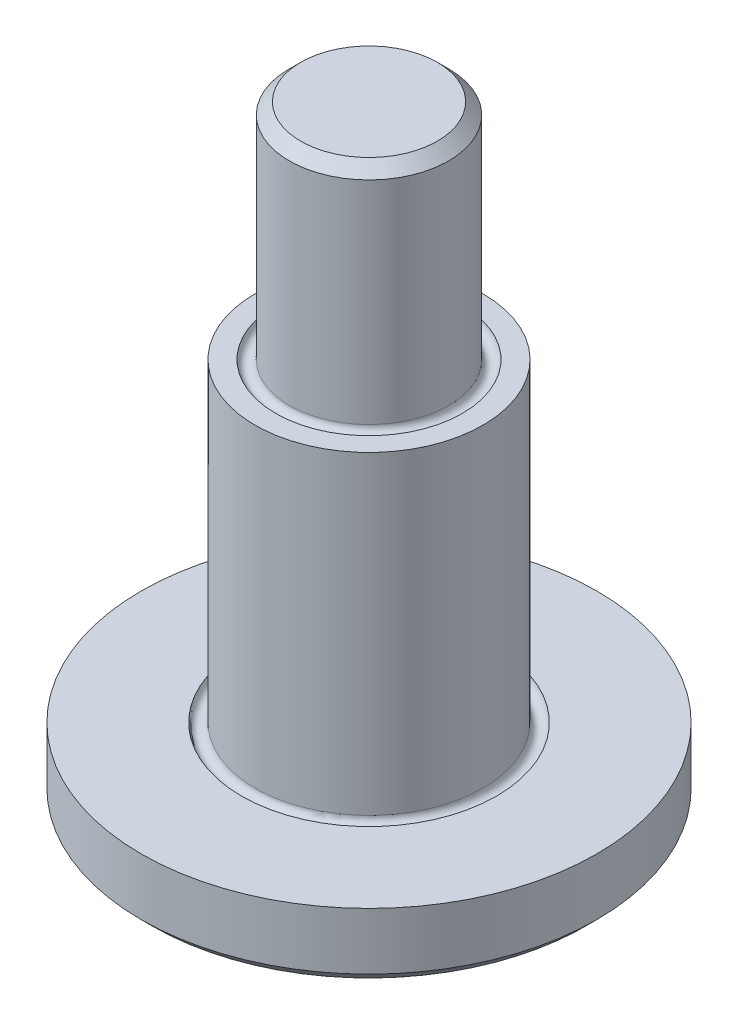
ISO-10303-21;
HEADER;
FILE_DESCRIPTION(('STEP AP214'),'2;1');
FILE_NAME('part.step','',(''),(''),'','','');
FILE_SCHEMA(('AUTOMOTIVE_DESIGN { 1 0 10303 214 1 1 1 1 }'));
ENDSEC;
DATA;
#1=APPLICATION_CONTEXT('core data for automotive mechanical design processes');
#2=APPLICATION_PROTOCOL_DEFINITION('international standard','automotive_design',2000,#1);
#3=PRODUCT_CONTEXT('',#1,'mechanical');
#4=PRODUCT('Part','Part','',(#3));
#5=PRODUCT_RELATED_PRODUCT_CATEGORY('part','',(#4));
#6=PRODUCT_DEFINITION_FORMATION('','',#4);
#7=PRODUCT_DEFINITION_CONTEXT('part definition',#1,'design');
#8=PRODUCT_DEFINITION('design','',#6,#7);
#9=PRODUCT_DEFINITION_SHAPE('','',#8);
#10=(LENGTH_UNIT() NAMED_UNIT(*) SI_UNIT(.MILLI.,.METRE.));
#11=(NAMED_UNIT(*) PLANE_ANGLE_UNIT() SI_UNIT($,.RADIAN.));
#12=(NAMED_UNIT(*) SI_UNIT($,.STERADIAN.) SOLID_ANGLE_UNIT());
#13=UNCERTAINTY_MEASURE_WITH_UNIT(LENGTH_MEASURE(1.E-05),#10,'distance_accuracy_value','');
#14=(GEOMETRIC_REPRESENTATION_CONTEXT(3) GLOBAL_UNCERTAINTY_ASSIGNED_CONTEXT((#13)) GLOBAL_UNIT_ASSIGNED_CONTEXT((#10,
#11,#12)) REPRESENTATION_CONTEXT('',''));
#15=CARTESIAN_POINT('',(0.,0.,0.));
#16=DIRECTION('',(0.,0.,1.));
#17=DIRECTION('',(1.,0.,0.));
#18=AXIS2_PLACEMENT_3D('',#15,#16,#17);
#19=CARTESIAN_POINT('',(2160.44957688834,589.234614361018,716.131939028989));
#20=DIRECTION('',(0.,1.,2.33732659270483E-13));
#21=DIRECTION('',(0.,-2.33732659270483E-13,1.));
#22=AXIS2_PLACEMENT_3D('',#19,#20,#21);
#23=CONICAL_SURFACE('',#22,9.99999999999979,0.785398163397226);
#24=CARTESIAN_POINT('',(2160.44957688834,588.734614361018,716.131939028989));
#25=DIRECTION('',(0.,-1.,-2.33732659270483E-13));
#26=DIRECTION('',(0.,2.33732659270483E-13,-1.));
#27=AXIS2_PLACEMENT_3D('',#24,#25,#26);
#28=CIRCLE('',#27,9.50000000000006);
#29=CARTESIAN_POINT('',(2160.44957688834,588.73461436102,706.631939028989));
#30=VERTEX_POINT('',#29);
#31=EDGE_CURVE('E68',#30,#30,#28,.T.);
#32=ORIENTED_EDGE('',*,*,#31,.F.);
#33=EDGE_LOOP('',(#32));
#34=FACE_BOUND('',#33,.T.);
#35=CARTESIAN_POINT('',(2160.44957688834,589.234614361018,716.131939028989));
#36=DIRECTION('',(0.,-1.,-2.33732659270483E-13));
#37=DIRECTION('',(0.,2.33732659270483E-13,-1.));
#38=AXIS2_PLACEMENT_3D('',#35,#36,#37);
#39=CIRCLE('',#38,9.99999999999979);
#40=CARTESIAN_POINT('',(2160.44957688834,589.23461436102,706.13193902899));
#41=VERTEX_POINT('',#40);
#42=EDGE_CURVE('E11',#41,#41,#39,.T.);
#43=ORIENTED_EDGE('',*,*,#42,.T.);
#44=EDGE_LOOP('',(#43));
#45=FACE_BOUND('',#44,.T.);
#46=ADVANCED_FACE('F35',(#34,#45),#23,.T.);
#47=CARTESIAN_POINT('',(2160.44957688834,588.734614361018,716.131939028989));
#48=DIRECTION('',(0.,-1.,-2.33732659270483E-13));
#49=DIRECTION('',(0.,2.33732659270483E-13,-1.));
#50=AXIS2_PLACEMENT_3D('',#47,#48,#49);
#51=CYLINDRICAL_SURFACE('',#50,9.99999999999979);
#52=ORIENTED_EDGE('',*,*,#42,.F.);
#53=EDGE_LOOP('',(#52));
#54=FACE_BOUND('',#53,.T.);
#55=CARTESIAN_POINT('',(2160.44957688834,591.734512957886,716.13193902899));
#56=DIRECTION('',(0.,-1.,-2.33732659270483E-13));
#57=DIRECTION('',(0.,2.33732659270483E-13,-1.));
#58=AXIS2_PLACEMENT_3D('',#55,#56,#57);
#59=CIRCLE('',#58,9.99999999999979);
#60=CARTESIAN_POINT('',(2160.44957688834,591.734512957888,706.13193902899));
#61=VERTEX_POINT('',#60);
#62=EDGE_CURVE('E41',#61,#61,#59,.T.);
#63=ORIENTED_EDGE('',*,*,#62,.T.);
#64=EDGE_LOOP('',(#63));
#65=FACE_BOUND('',#64,.T.);
#66=ADVANCED_FACE('F78',(#54,#65),#51,.T.);
#67=CARTESIAN_POINT('',(2166.04957684892,591.734512957886,716.13193902899));
#68=DIRECTION('',(0.,-1.,-2.33732659270483E-13));
#69=DIRECTION('',(0.,2.33732659270483E-13,-1.));
#70=AXIS2_PLACEMENT_3D('',#67,#68,#69);
#71=PLANE('',#70);
#72=ORIENTED_EDGE('',*,*,#62,.F.);
#73=EDGE_LOOP('',(#72));
#74=FACE_BOUND('',#73,.T.);
#75=CARTESIAN_POINT('',(2160.44957688834,591.734512957886,716.13193902899));
#76=DIRECTION('',(0.,-1.,-2.33732659270483E-13));
#77=DIRECTION('',(0.,2.33732659270483E-13,-1.));
#78=AXIS2_PLACEMENT_3D('',#75,#76,#77);
#79=CIRCLE('',#78,5.5999999605767);
#80=CARTESIAN_POINT('',(2160.44957688834,591.734512957887,710.531939068413));
#81=VERTEX_POINT('',#80);
#82=EDGE_CURVE('E45',#81,#81,#79,.T.);
#83=ORIENTED_EDGE('',*,*,#82,.T.);
#84=EDGE_LOOP('',(#83));
#85=FACE_BOUND('',#84,.T.);
#86=ADVANCED_FACE('F82',(#74,#85),#71,.F.);
#87=CARTESIAN_POINT('',(2160.44957688834,591.734359160488,716.13193902899));
#88=DIRECTION('',(0.,-1.,-2.33732659270483E-13));
#89=DIRECTION('',(0.,2.33732659270483E-13,-1.));
#90=AXIS2_PLACEMENT_3D('',#87,#88,#89);
#91=TOROIDAL_SURFACE('',#90,5.29999999999964,0.299999999999769);
#92=ORIENTED_EDGE('',*,*,#82,.F.);
#93=EDGE_LOOP('',(#92));
#94=FACE_BOUND('',#93,.T.);
#95=CARTESIAN_POINT('',(2160.44957688834,591.734359160488,716.13193902899));
#96=DIRECTION('',(0.,-1.,-2.33732659270483E-13));
#97=DIRECTION('',(0.,2.33732659270483E-13,-1.));
#98=AXIS2_PLACEMENT_3D('',#95,#96,#97);
#99=CIRCLE('',#98,4.99999999999989);
#100=CARTESIAN_POINT('',(2160.44957688834,591.734359160489,711.13193902899));
#101=VERTEX_POINT('',#100);
#102=EDGE_CURVE('E49',#101,#101,#99,.T.);
#103=ORIENTED_EDGE('',*,*,#102,.T.);
#104=EDGE_LOOP('',(#103));
#105=FACE_BOUND('',#104,.T.);
#106=ADVANCED_FACE('F87',(#94,#105),#91,.F.);
#107=CARTESIAN_POINT('',(2160.44957688834,588.734614361018,716.131939028989));
#108=DIRECTION('',(0.,-1.,-2.33732659270483E-13));
#109=DIRECTION('',(0.,2.33732659270483E-13,-1.));
#110=AXIS2_PLACEMENT_3D('',#107,#108,#109);
#111=CYLINDRICAL_SURFACE('',#110,4.99999999999989);
#112=ORIENTED_EDGE('',*,*,#102,.F.);
#113=EDGE_LOOP('',(#112));
#114=FACE_BOUND('',#113,.T.);
#115=CARTESIAN_POINT('',(2160.44957688834,605.534512949952,716.131939028993));
#116=DIRECTION('',(0.,-1.,-2.33732659270483E-13));
#117=DIRECTION('',(0.,2.33732659270483E-13,-1.));
#118=AXIS2_PLACEMENT_3D('',#115,#116,#117);
#119=CIRCLE('',#118,4.99999999999989);
#120=CARTESIAN_POINT('',(2160.44957688834,605.534512949954,711.131939028993));
#121=VERTEX_POINT('',#120);
#122=EDGE_CURVE('E54',#121,#121,#119,.T.);
#123=ORIENTED_EDGE('',*,*,#122,.T.);
#124=EDGE_LOOP('',(#123));
#125=FACE_BOUND('',#124,.T.);
#126=ADVANCED_FACE('F93',(#114,#125),#111,.T.);
#127=CARTESIAN_POINT('',(2164.54957684907,605.534512949953,716.131939028993));
#128=DIRECTION('',(0.,-1.,-2.33732659270483E-13));
#129=DIRECTION('',(0.,2.33732659270483E-13,-1.));
#130=AXIS2_PLACEMENT_3D('',#127,#128,#129);
#131=PLANE('',#130);
#132=ORIENTED_EDGE('',*,*,#122,.F.);
#133=EDGE_LOOP('',(#132));
#134=FACE_BOUND('',#133,.T.);
#135=CARTESIAN_POINT('',(2160.44957688834,605.534512949953,716.131939028993));
#136=DIRECTION('',(0.,-1.,-2.33732659270483E-13));
#137=DIRECTION('',(0.,2.33732659270483E-13,-1.));
#138=AXIS2_PLACEMENT_3D('',#135,#136,#137);
#139=CIRCLE('',#138,4.09999996072496);
#140=CARTESIAN_POINT('',(2160.44957688834,605.534512949954,712.031939068268));
#141=VERTEX_POINT('',#140);
#142=EDGE_CURVE('E57',#141,#141,#139,.T.);
#143=ORIENTED_EDGE('',*,*,#142,.T.);
#144=EDGE_LOOP('',(#143));
#145=FACE_BOUND('',#144,.T.);
#146=ADVANCED_FACE('F97',(#134,#145),#131,.F.);
#147=CARTESIAN_POINT('',(2160.44957688834,605.534359441931,716.131939028993));
#148=DIRECTION('',(0.,-1.,-2.33732659270483E-13));
#149=DIRECTION('',(0.,2.33732659270483E-13,-1.));
#150=AXIS2_PLACEMENT_3D('',#147,#148,#149);
#151=TOROIDAL_SURFACE('',#150,3.79999999999958,0.299999999999826);
#152=ORIENTED_EDGE('',*,*,#142,.F.);
#153=EDGE_LOOP('',(#152));
#154=FACE_BOUND('',#153,.T.);
#155=CARTESIAN_POINT('',(2160.44957688834,605.534359441931,716.131939028993));
#156=DIRECTION('',(0.,-1.,-2.33732659270483E-13));
#157=DIRECTION('',(0.,2.33732659270483E-13,-1.));
#158=AXIS2_PLACEMENT_3D('',#155,#156,#157);
#159=CIRCLE('',#158,3.49999999999984);
#160=CARTESIAN_POINT('',(2160.44957688834,605.534359441932,712.631939028993));
#161=VERTEX_POINT('',#160);
#162=EDGE_CURVE('E60',#161,#161,#159,.T.);
#163=ORIENTED_EDGE('',*,*,#162,.T.);
#164=EDGE_LOOP('',(#163));
#165=FACE_BOUND('',#164,.T.);
#166=ADVANCED_FACE('F101',(#154,#165),#151,.F.);
#167=CARTESIAN_POINT('',(2160.44957688834,588.734614361018,716.131939028989));
#168=DIRECTION('',(0.,-1.,-2.33732659270483E-13));
#169=DIRECTION('',(0.,2.33732659270483E-13,-1.));
#170=AXIS2_PLACEMENT_3D('',#167,#168,#169);
#171=CYLINDRICAL_SURFACE('',#170,3.49999999999984);
#172=ORIENTED_EDGE('',*,*,#162,.F.);
#173=EDGE_LOOP('',(#172));
#174=FACE_BOUND('',#173,.T.);
#175=CARTESIAN_POINT('',(2160.44957688834,614.834513231713,716.131939028995));
#176=DIRECTION('',(0.,-1.,-2.33732659270483E-13));
#177=DIRECTION('',(0.,2.33732659270483E-13,-1.));
#178=AXIS2_PLACEMENT_3D('',#175,#176,#177);
#179=CIRCLE('',#178,3.49999999999984);
#180=CARTESIAN_POINT('',(2160.44957688834,614.834513231714,712.631939028996));
#181=VERTEX_POINT('',#180);
#182=EDGE_CURVE('E63',#181,#181,#179,.T.);
#183=ORIENTED_EDGE('',*,*,#182,.T.);
#184=EDGE_LOOP('',(#183));
#185=FACE_BOUND('',#184,.T.);
#186=ADVANCED_FACE('F105',(#174,#185),#171,.T.);
#187=CARTESIAN_POINT('',(2160.44957688834,615.334513231713,716.131939028995));
#188=DIRECTION('',(0.,-1.,-2.33732659270483E-13));
#189=DIRECTION('',(0.,2.33732659270483E-13,-1.));
#190=AXIS2_PLACEMENT_3D('',#187,#188,#189);
#191=CONICAL_SURFACE('',#190,2.99999999999967,0.78539816339767);
#192=ORIENTED_EDGE('',*,*,#182,.F.);
#193=EDGE_LOOP('',(#192));
#194=FACE_BOUND('',#193,.T.);
#195=CARTESIAN_POINT('',(2160.44957688834,615.334513231713,716.131939028995));
#196=DIRECTION('',(0.,-1.,-2.33732659270483E-13));
#197=DIRECTION('',(0.,2.33732659270483E-13,-1.));
#198=AXIS2_PLACEMENT_3D('',#195,#196,#197);
#199=CIRCLE('',#198,2.99999999999967);
#200=CARTESIAN_POINT('',(2160.44957688834,615.334513231714,713.131939028996));
#201=VERTEX_POINT('',#200);
#202=EDGE_CURVE('E66',#201,#201,#199,.T.);
#203=ORIENTED_EDGE('',*,*,#202,.T.);
#204=EDGE_LOOP('',(#203));
#205=FACE_BOUND('',#204,.T.);
#206=ADVANCED_FACE('F109',(#194,#205),#191,.T.);
#207=CARTESIAN_POINT('',(2160.44957688834,615.334513231713,716.131939028995));
#208=DIRECTION('',(0.,-1.,-2.33732659270483E-13));
#209=DIRECTION('',(0.,2.33732659270483E-13,-1.));
#210=AXIS2_PLACEMENT_3D('',#207,#208,#209);
#211=PLANE('',#210);
#212=ORIENTED_EDGE('',*,*,#202,.F.);
#213=EDGE_LOOP('',(#212));
#214=FACE_BOUND('',#213,.T.);
#215=ADVANCED_FACE('F113',(#214),#211,.F.);
#216=CARTESIAN_POINT('',(2169.94957688834,588.734614361018,716.131939028989));
#217=DIRECTION('',(0.,1.,2.33732659270483E-13));
#218=DIRECTION('',(0.,-2.33732659270483E-13,1.));
#219=AXIS2_PLACEMENT_3D('',#216,#217,#218);
#220=PLANE('',#219);
#221=ORIENTED_EDGE('',*,*,#31,.T.);
#222=EDGE_LOOP('',(#221));
#223=FACE_BOUND('',#222,.T.);
#224=ADVANCED_FACE('F75',(#223),#220,.F.);
#225=CLOSED_SHELL('',(#46,#66,#86,#106,#126,#146,#166,#186,#206,#215,#224));
#226=MANIFOLD_SOLID_BREP('B2',#225);
#227=ADVANCED_BREP_SHAPE_REPRESENTATION('',(#18,#226),#14);
#228=SHAPE_DEFINITION_REPRESENTATION(#9,#227);
ENDSEC;
END-ISO-10303-21;
